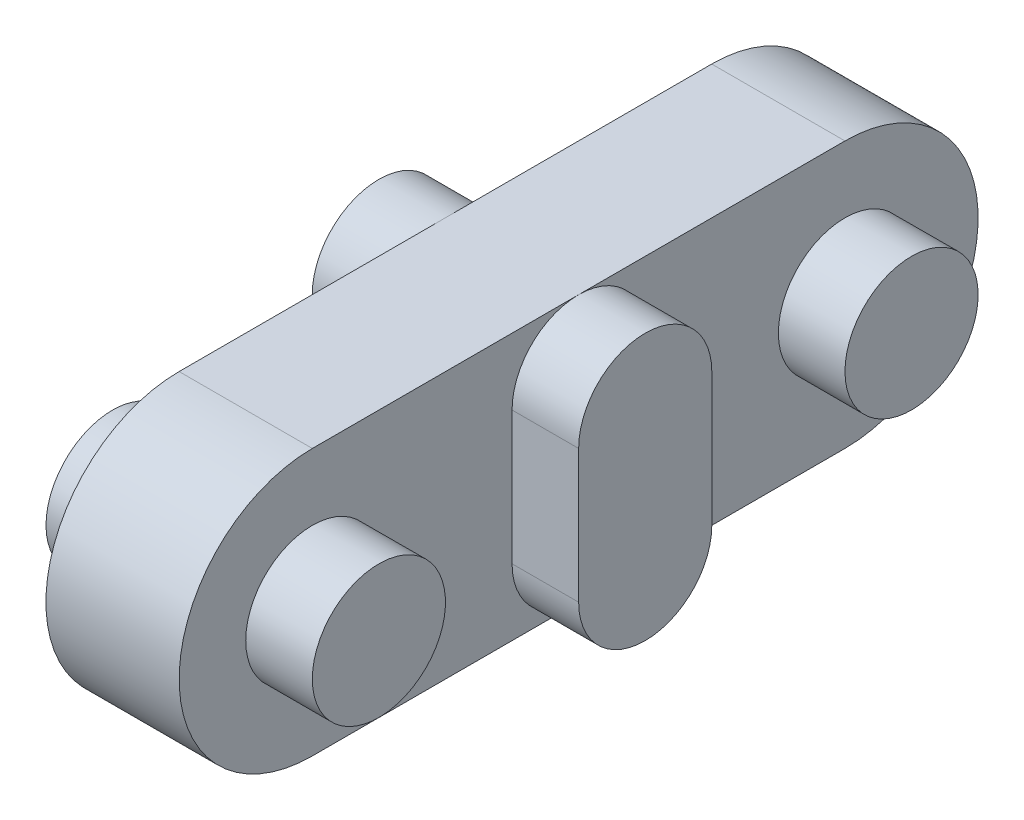
ISO-10303-21;
HEADER;
FILE_DESCRIPTION(('STEP AP214'),'2;1');
FILE_NAME('part.step','',(''),(''),'','','');
FILE_SCHEMA(('AUTOMOTIVE_DESIGN { 1 0 10303 214 1 1 1 1 }'));
ENDSEC;
DATA;
#1=APPLICATION_CONTEXT('core data for automotive mechanical design processes');
#2=APPLICATION_PROTOCOL_DEFINITION('international standard','automotive_design',2000,#1);
#3=PRODUCT_CONTEXT('',#1,'mechanical');
#4=PRODUCT('Part','Part','',(#3));
#5=PRODUCT_RELATED_PRODUCT_CATEGORY('part','',(#4));
#6=PRODUCT_DEFINITION_FORMATION('','',#4);
#7=PRODUCT_DEFINITION_CONTEXT('part definition',#1,'design');
#8=PRODUCT_DEFINITION('design','',#6,#7);
#9=PRODUCT_DEFINITION_SHAPE('','',#8);
#10=(LENGTH_UNIT() NAMED_UNIT(*) SI_UNIT(.MILLI.,.METRE.));
#11=(NAMED_UNIT(*) PLANE_ANGLE_UNIT() SI_UNIT($,.RADIAN.));
#12=(NAMED_UNIT(*) SI_UNIT($,.STERADIAN.) SOLID_ANGLE_UNIT());
#13=UNCERTAINTY_MEASURE_WITH_UNIT(LENGTH_MEASURE(1.E-05),#10,'distance_accuracy_value','');
#14=(GEOMETRIC_REPRESENTATION_CONTEXT(3) GLOBAL_UNCERTAINTY_ASSIGNED_CONTEXT((#13)) GLOBAL_UNIT_ASSIGNED_CONTEXT((#10,
#11,#12)) REPRESENTATION_CONTEXT('',''));
#15=CARTESIAN_POINT('',(0.,0.,0.));
#16=DIRECTION('',(0.,0.,1.));
#17=DIRECTION('',(1.,0.,0.));
#18=AXIS2_PLACEMENT_3D('',#15,#16,#17);
#19=CARTESIAN_POINT('',(0.,-5.,5.));
#20=DIRECTION('',(1.,0.,0.));
#21=DIRECTION('',(0.,0.,-1.));
#22=AXIS2_PLACEMENT_3D('',#19,#20,#21);
#23=PLANE('',#22);
#24=CARTESIAN_POINT('',(0.,-5.,5.));
#25=DIRECTION('',(-1.,0.,0.));
#26=DIRECTION('',(0.,0.,1.));
#27=AXIS2_PLACEMENT_3D('',#24,#25,#26);
#28=CIRCLE('',#27,2.5);
#29=CARTESIAN_POINT('',(0.,-5.,7.5));
#30=VERTEX_POINT('',#29);
#31=EDGE_CURVE('E164',#30,#30,#28,.T.);
#32=ORIENTED_EDGE('',*,*,#31,.F.);
#33=EDGE_LOOP('',(#32));
#34=FACE_BOUND('',#33,.T.);
#35=DIRECTION('',(0.,-1.,0.));
#36=VECTOR('',#35,1.);
#37=CARTESIAN_POINT('',(0.,-2.5,12.5));
#38=LINE('',#37,#36);
#39=CARTESIAN_POINT('',(0.,-2.5,12.5));
#40=VERTEX_POINT('',#39);
#41=CARTESIAN_POINT('',(0.,-7.5,12.5));
#42=VERTEX_POINT('',#41);
#43=EDGE_CURVE('E54',#40,#42,#38,.T.);
#44=ORIENTED_EDGE('',*,*,#43,.F.);
#45=CARTESIAN_POINT('',(0.,-2.5,15.));
#46=DIRECTION('',(1.,0.,0.));
#47=DIRECTION('',(0.,0.,-1.));
#48=AXIS2_PLACEMENT_3D('',#45,#46,#47);
#49=CIRCLE('',#48,2.5);
#50=CARTESIAN_POINT('',(0.,0.,15.));
#51=VERTEX_POINT('',#50);
#52=EDGE_CURVE('E182',#51,#40,#49,.F.);
#53=ORIENTED_EDGE('',*,*,#52,.F.);
#54=DIRECTION('',(0.,0.,1.));
#55=VECTOR('',#54,1.);
#56=CARTESIAN_POINT('',(0.,0.,5.));
#57=LINE('',#56,#55);
#58=CARTESIAN_POINT('',(0.,0.,5.));
#59=VERTEX_POINT('',#58);
#60=EDGE_CURVE('E225',#59,#51,#57,.T.);
#61=ORIENTED_EDGE('',*,*,#60,.F.);
#62=CARTESIAN_POINT('',(0.,-5.,5.));
#63=DIRECTION('',(1.,0.,0.));
#64=DIRECTION('',(0.,0.,-1.));
#65=AXIS2_PLACEMENT_3D('',#62,#63,#64);
#66=CIRCLE('',#65,5.);
#67=CARTESIAN_POINT('',(0.,-10.,5.));
#68=VERTEX_POINT('',#67);
#69=EDGE_CURVE('E220',#68,#59,#66,.T.);
#70=ORIENTED_EDGE('',*,*,#69,.F.);
#71=DIRECTION('',(0.,0.,-1.));
#72=VECTOR('',#71,1.);
#73=CARTESIAN_POINT('',(0.,-10.,25.));
#74=LINE('',#73,#72);
#75=CARTESIAN_POINT('',(0.,-10.,15.));
#76=VERTEX_POINT('',#75);
#77=EDGE_CURVE('E231',#76,#68,#74,.T.);
#78=ORIENTED_EDGE('',*,*,#77,.F.);
#79=CARTESIAN_POINT('',(0.,-7.5,15.));
#80=DIRECTION('',(1.,0.,0.));
#81=DIRECTION('',(0.,0.,-1.));
#82=AXIS2_PLACEMENT_3D('',#79,#80,#81);
#83=CIRCLE('',#82,2.5);
#84=EDGE_CURVE('E59',#42,#76,#83,.F.);
#85=ORIENTED_EDGE('',*,*,#84,.F.);
#86=EDGE_LOOP('',(#44,#53,#61,#70,#78,#85));
#87=FACE_BOUND('',#86,.T.);
#88=ADVANCED_FACE('F39',(#34,#87),#23,.F.);
#89=CARTESIAN_POINT('',(0.,-5.,25.));
#90=DIRECTION('',(-1.,0.,0.));
#91=DIRECTION('',(0.,0.,1.));
#92=AXIS2_PLACEMENT_3D('',#89,#90,#91);
#93=CIRCLE('',#92,2.5);
#94=CARTESIAN_POINT('',(0.,-5.,27.5));
#95=VERTEX_POINT('',#94);
#96=EDGE_CURVE('E543',#95,#95,#93,.T.);
#97=ORIENTED_EDGE('',*,*,#96,.F.);
#98=EDGE_LOOP('',(#97));
#99=FACE_BOUND('',#98,.T.);
#100=CARTESIAN_POINT('',(0.,-7.5,17.5));
#101=VERTEX_POINT('',#100);
#102=EDGE_CURVE('E146',#76,#101,#83,.F.);
#103=ORIENTED_EDGE('',*,*,#102,.F.);
#104=CARTESIAN_POINT('',(0.,-10.,25.));
#105=VERTEX_POINT('',#104);
#106=EDGE_CURVE('E232',#105,#76,#74,.T.);
#107=ORIENTED_EDGE('',*,*,#106,.F.);
#108=CARTESIAN_POINT('',(0.,-5.,25.));
#109=DIRECTION('',(1.,0.,0.));
#110=DIRECTION('',(0.,0.,-1.));
#111=AXIS2_PLACEMENT_3D('',#108,#109,#110);
#112=CIRCLE('',#111,5.);
#113=CARTESIAN_POINT('',(0.,0.,25.));
#114=VERTEX_POINT('',#113);
#115=EDGE_CURVE('E228',#114,#105,#112,.T.);
#116=ORIENTED_EDGE('',*,*,#115,.F.);
#117=EDGE_CURVE('E223',#51,#114,#57,.T.);
#118=ORIENTED_EDGE('',*,*,#117,.F.);
#119=CARTESIAN_POINT('',(0.,-2.5,17.5));
#120=VERTEX_POINT('',#119);
#121=EDGE_CURVE('E178',#120,#51,#49,.F.);
#122=ORIENTED_EDGE('',*,*,#121,.F.);
#123=DIRECTION('',(0.,1.,0.));
#124=VECTOR('',#123,1.);
#125=CARTESIAN_POINT('',(0.,-7.5,17.5));
#126=LINE('',#125,#124);
#127=EDGE_CURVE('E181',#101,#120,#126,.T.);
#128=ORIENTED_EDGE('',*,*,#127,.F.);
#129=EDGE_LOOP('',(#103,#107,#116,#118,#122,#128));
#130=FACE_BOUND('',#129,.T.);
#131=ADVANCED_FACE('F318',(#99,#130),#23,.F.);
#132=CARTESIAN_POINT('',(5.00229629775137,-5.,5.));
#133=DIRECTION('',(1.,0.,0.));
#134=DIRECTION('',(0.,0.,-1.));
#135=AXIS2_PLACEMENT_3D('',#132,#133,#134);
#136=PLANE('',#135);
#137=CARTESIAN_POINT('',(5.00229629775137,-5.,5.));
#138=DIRECTION('',(1.,0.,0.));
#139=DIRECTION('',(0.,0.,-1.));
#140=AXIS2_PLACEMENT_3D('',#137,#138,#139);
#141=CIRCLE('',#140,2.5);
#142=CARTESIAN_POINT('',(5.00229629775137,-5.,2.5));
#143=VERTEX_POINT('',#142);
#144=EDGE_CURVE('E47',#143,#143,#141,.T.);
#145=ORIENTED_EDGE('',*,*,#144,.F.);
#146=EDGE_LOOP('',(#145));
#147=FACE_BOUND('',#146,.T.);
#148=CARTESIAN_POINT('',(5.00229629775137,-2.5,15.));
#149=DIRECTION('',(1.,0.,0.));
#150=DIRECTION('',(0.,0.,-1.));
#151=AXIS2_PLACEMENT_3D('',#148,#149,#150);
#152=CIRCLE('',#151,2.5);
#153=CARTESIAN_POINT('',(5.00229629775137,0.,15.));
#154=VERTEX_POINT('',#153);
#155=CARTESIAN_POINT('',(5.00229629775137,-2.5,12.5));
#156=VERTEX_POINT('',#155);
#157=EDGE_CURVE('E219',#154,#156,#152,.F.);
#158=ORIENTED_EDGE('',*,*,#157,.T.);
#159=DIRECTION('',(0.,-1.,0.));
#160=VECTOR('',#159,1.);
#161=CARTESIAN_POINT('',(5.00229629775137,-7.5,12.5));
#162=LINE('',#161,#160);
#163=CARTESIAN_POINT('',(5.00229629775137,-7.5,12.5));
#164=VERTEX_POINT('',#163);
#165=EDGE_CURVE('E206',#156,#164,#162,.T.);
#166=ORIENTED_EDGE('',*,*,#165,.T.);
#167=CARTESIAN_POINT('',(5.00229629775137,-7.5,15.));
#168=DIRECTION('',(1.,0.,0.));
#169=DIRECTION('',(0.,0.,-1.));
#170=AXIS2_PLACEMENT_3D('',#167,#168,#169);
#171=CIRCLE('',#170,2.5);
#172=CARTESIAN_POINT('',(5.00229629775137,-10.,15.));
#173=VERTEX_POINT('',#172);
#174=EDGE_CURVE('E210',#164,#173,#171,.F.);
#175=ORIENTED_EDGE('',*,*,#174,.T.);
#176=DIRECTION('',(0.,0.,-1.));
#177=VECTOR('',#176,1.);
#178=CARTESIAN_POINT('',(5.00229629775137,-10.,25.));
#179=LINE('',#178,#177);
#180=CARTESIAN_POINT('',(5.00229629775137,-10.,5.));
#181=VERTEX_POINT('',#180);
#182=EDGE_CURVE('E245',#173,#181,#179,.T.);
#183=ORIENTED_EDGE('',*,*,#182,.T.);
#184=CARTESIAN_POINT('',(5.00229629775137,-5.,5.));
#185=DIRECTION('',(1.,0.,0.));
#186=DIRECTION('',(0.,0.,-1.));
#187=AXIS2_PLACEMENT_3D('',#184,#185,#186);
#188=CIRCLE('',#187,5.);
#189=CARTESIAN_POINT('',(5.00229629775137,0.,5.));
#190=VERTEX_POINT('',#189);
#191=EDGE_CURVE('E209',#181,#190,#188,.T.);
#192=ORIENTED_EDGE('',*,*,#191,.T.);
#193=DIRECTION('',(0.,0.,1.));
#194=VECTOR('',#193,1.);
#195=CARTESIAN_POINT('',(5.00229629775137,0.,5.));
#196=LINE('',#195,#194);
#197=EDGE_CURVE('E239',#190,#154,#196,.T.);
#198=ORIENTED_EDGE('',*,*,#197,.T.);
#199=EDGE_LOOP('',(#158,#166,#175,#183,#192,#198));
#200=FACE_BOUND('',#199,.T.);
#201=ADVANCED_FACE('F265',(#147,#200),#136,.T.);
#202=CARTESIAN_POINT('',(0.,-5.,5.));
#203=DIRECTION('',(1.,0.,0.));
#204=DIRECTION('',(0.,0.,-1.));
#205=AXIS2_PLACEMENT_3D('',#202,#203,#204);
#206=CYLINDRICAL_SURFACE('',#205,5.);
#207=ORIENTED_EDGE('',*,*,#191,.F.);
#208=DIRECTION('',(1.,0.,0.));
#209=VECTOR('',#208,1.);
#210=CARTESIAN_POINT('',(0.,-10.,5.));
#211=LINE('',#210,#209);
#212=EDGE_CURVE('E248',#68,#181,#211,.T.);
#213=ORIENTED_EDGE('',*,*,#212,.F.);
#214=ORIENTED_EDGE('',*,*,#69,.T.);
#215=DIRECTION('',(1.,0.,0.));
#216=VECTOR('',#215,1.);
#217=CARTESIAN_POINT('',(0.,0.,5.));
#218=LINE('',#217,#216);
#219=EDGE_CURVE('E235',#59,#190,#218,.T.);
#220=ORIENTED_EDGE('',*,*,#219,.T.);
#221=EDGE_LOOP('',(#207,#213,#214,#220));
#222=FACE_BOUND('',#221,.T.);
#223=ADVANCED_FACE('F41',(#222),#206,.T.);
#224=CARTESIAN_POINT('',(0.,-10.,25.));
#225=DIRECTION('',(0.,-1.,0.));
#226=DIRECTION('',(0.,0.,-1.));
#227=AXIS2_PLACEMENT_3D('',#224,#225,#226);
#228=PLANE('',#227);
#229=CARTESIAN_POINT('',(5.00229629775137,-10.,25.));
#230=VERTEX_POINT('',#229);
#231=EDGE_CURVE('E224',#230,#173,#179,.T.);
#232=ORIENTED_EDGE('',*,*,#231,.F.);
#233=DIRECTION('',(1.,0.,0.));
#234=VECTOR('',#233,1.);
#235=CARTESIAN_POINT('',(0.,-10.,25.));
#236=LINE('',#235,#234);
#237=EDGE_CURVE('E251',#105,#230,#236,.T.);
#238=ORIENTED_EDGE('',*,*,#237,.F.);
#239=ORIENTED_EDGE('',*,*,#106,.T.);
#240=ORIENTED_EDGE('',*,*,#77,.T.);
#241=ORIENTED_EDGE('',*,*,#212,.T.);
#242=ORIENTED_EDGE('',*,*,#182,.F.);
#243=EDGE_LOOP('',(#232,#238,#239,#240,#241,#242));
#244=FACE_BOUND('',#243,.T.);
#245=ADVANCED_FACE('F285',(#244),#228,.T.);
#246=CARTESIAN_POINT('',(0.,-5.,25.));
#247=DIRECTION('',(1.,0.,0.));
#248=DIRECTION('',(0.,0.,-1.));
#249=AXIS2_PLACEMENT_3D('',#246,#247,#248);
#250=CYLINDRICAL_SURFACE('',#249,5.);
#251=CARTESIAN_POINT('',(5.00229629775137,-5.,25.));
#252=DIRECTION('',(1.,0.,0.));
#253=DIRECTION('',(0.,0.,-1.));
#254=AXIS2_PLACEMENT_3D('',#251,#252,#253);
#255=CIRCLE('',#254,5.);
#256=CARTESIAN_POINT('',(5.00229629775137,0.,25.));
#257=VERTEX_POINT('',#256);
#258=EDGE_CURVE('E242',#257,#230,#255,.T.);
#259=ORIENTED_EDGE('',*,*,#258,.F.);
#260=DIRECTION('',(1.,0.,0.));
#261=VECTOR('',#260,1.);
#262=CARTESIAN_POINT('',(0.,0.,25.));
#263=LINE('',#262,#261);
#264=EDGE_CURVE('E253',#114,#257,#263,.T.);
#265=ORIENTED_EDGE('',*,*,#264,.F.);
#266=ORIENTED_EDGE('',*,*,#115,.T.);
#267=ORIENTED_EDGE('',*,*,#237,.T.);
#268=EDGE_LOOP('',(#259,#265,#266,#267));
#269=FACE_BOUND('',#268,.T.);
#270=ADVANCED_FACE('F281',(#269),#250,.T.);
#271=CARTESIAN_POINT('',(0.,0.,5.));
#272=DIRECTION('',(0.,1.,0.));
#273=DIRECTION('',(0.,0.,1.));
#274=AXIS2_PLACEMENT_3D('',#271,#272,#273);
#275=PLANE('',#274);
#276=ORIENTED_EDGE('',*,*,#197,.F.);
#277=ORIENTED_EDGE('',*,*,#219,.F.);
#278=ORIENTED_EDGE('',*,*,#60,.T.);
#279=ORIENTED_EDGE('',*,*,#117,.T.);
#280=ORIENTED_EDGE('',*,*,#264,.T.);
#281=EDGE_CURVE('E238',#154,#257,#196,.T.);
#282=ORIENTED_EDGE('',*,*,#281,.F.);
#283=EDGE_LOOP('',(#276,#277,#278,#279,#280,#282));
#284=FACE_BOUND('',#283,.T.);
#285=ADVANCED_FACE('F275',(#284),#275,.T.);
#286=CARTESIAN_POINT('',(5.00229629775137,-5.,25.));
#287=DIRECTION('',(1.,0.,0.));
#288=DIRECTION('',(0.,0.,-1.));
#289=AXIS2_PLACEMENT_3D('',#286,#287,#288);
#290=CIRCLE('',#289,2.5);
#291=CARTESIAN_POINT('',(5.00229629775137,-5.,22.5));
#292=VERTEX_POINT('',#291);
#293=EDGE_CURVE('E11',#292,#292,#290,.T.);
#294=ORIENTED_EDGE('',*,*,#293,.F.);
#295=EDGE_LOOP('',(#294));
#296=FACE_BOUND('',#295,.T.);
#297=ORIENTED_EDGE('',*,*,#231,.T.);
#298=CARTESIAN_POINT('',(5.00229629775137,-7.5,17.5));
#299=VERTEX_POINT('',#298);
#300=EDGE_CURVE('E214',#173,#299,#171,.F.);
#301=ORIENTED_EDGE('',*,*,#300,.T.);
#302=DIRECTION('',(0.,1.,0.));
#303=VECTOR('',#302,1.);
#304=CARTESIAN_POINT('',(5.00229629775137,-2.5,17.5));
#305=LINE('',#304,#303);
#306=CARTESIAN_POINT('',(5.00229629775137,-2.5,17.5));
#307=VERTEX_POINT('',#306);
#308=EDGE_CURVE('E213',#299,#307,#305,.T.);
#309=ORIENTED_EDGE('',*,*,#308,.T.);
#310=EDGE_CURVE('E200',#307,#154,#152,.F.);
#311=ORIENTED_EDGE('',*,*,#310,.T.);
#312=ORIENTED_EDGE('',*,*,#281,.T.);
#313=ORIENTED_EDGE('',*,*,#258,.T.);
#314=EDGE_LOOP('',(#297,#301,#309,#311,#312,#313));
#315=FACE_BOUND('',#314,.T.);
#316=ADVANCED_FACE('F273',(#296,#315),#136,.T.);
#317=CARTESIAN_POINT('',(-0.00199999999999419,-2.5,17.5));
#318=DIRECTION('',(0.,0.,1.));
#319=DIRECTION('',(1.,0.,0.));
#320=AXIS2_PLACEMENT_3D('',#317,#318,#319);
#321=PLANE('',#320);
#322=ORIENTED_EDGE('',*,*,#308,.F.);
#323=DIRECTION('',(1.,0.,0.));
#324=VECTOR('',#323,1.);
#325=CARTESIAN_POINT('',(-0.00199999999999419,-7.5,17.5));
#326=LINE('',#325,#324);
#327=CARTESIAN_POINT('',(7.50229629775137,-7.5,17.5));
#328=VERTEX_POINT('',#327);
#329=EDGE_CURVE('E201',#299,#328,#326,.T.);
#330=ORIENTED_EDGE('',*,*,#329,.T.);
#331=DIRECTION('',(0.,-1.,0.));
#332=VECTOR('',#331,1.);
#333=CARTESIAN_POINT('',(7.50229629775137,-2.5,17.5));
#334=LINE('',#333,#332);
#335=CARTESIAN_POINT('',(7.50229629775137,-2.5,17.5));
#336=VERTEX_POINT('',#335);
#337=EDGE_CURVE('E193',#336,#328,#334,.T.);
#338=ORIENTED_EDGE('',*,*,#337,.F.);
#339=DIRECTION('',(1.,0.,0.));
#340=VECTOR('',#339,1.);
#341=CARTESIAN_POINT('',(-0.00199999999999419,-2.5,17.5));
#342=LINE('',#341,#340);
#343=EDGE_CURVE('E198',#307,#336,#342,.T.);
#344=ORIENTED_EDGE('',*,*,#343,.F.);
#345=EDGE_LOOP('',(#322,#330,#338,#344));
#346=FACE_BOUND('',#345,.T.);
#347=ADVANCED_FACE('F300',(#346),#321,.T.);
#348=CARTESIAN_POINT('',(-0.00199999999999419,-7.5,15.));
#349=DIRECTION('',(1.,0.,0.));
#350=DIRECTION('',(0.,0.,-1.));
#351=AXIS2_PLACEMENT_3D('',#348,#349,#350);
#352=CYLINDRICAL_SURFACE('',#351,2.5);
#353=ORIENTED_EDGE('',*,*,#329,.F.);
#354=ORIENTED_EDGE('',*,*,#300,.F.);
#355=ORIENTED_EDGE('',*,*,#174,.F.);
#356=DIRECTION('',(1.,0.,0.));
#357=VECTOR('',#356,1.);
#358=CARTESIAN_POINT('',(-0.00199999999999419,-7.5,12.5));
#359=LINE('',#358,#357);
#360=CARTESIAN_POINT('',(7.50229629775137,-7.5,12.5));
#361=VERTEX_POINT('',#360);
#362=EDGE_CURVE('E203',#164,#361,#359,.T.);
#363=ORIENTED_EDGE('',*,*,#362,.T.);
#364=CARTESIAN_POINT('',(7.50229629775137,-7.5,15.));
#365=DIRECTION('',(1.,0.,0.));
#366=DIRECTION('',(0.,0.,-1.));
#367=AXIS2_PLACEMENT_3D('',#364,#365,#366);
#368=CIRCLE('',#367,2.5);
#369=EDGE_CURVE('E190',#328,#361,#368,.T.);
#370=ORIENTED_EDGE('',*,*,#369,.F.);
#371=EDGE_LOOP('',(#353,#354,#355,#363,#370));
#372=FACE_BOUND('',#371,.T.);
#373=ADVANCED_FACE('F291',(#372),#352,.T.);
#374=CARTESIAN_POINT('',(7.50229629775137,-2.5,15.));
#375=DIRECTION('',(1.,0.,0.));
#376=DIRECTION('',(0.,0.,-1.));
#377=AXIS2_PLACEMENT_3D('',#374,#375,#376);
#378=PLANE('',#377);
#379=CARTESIAN_POINT('',(7.50229629775137,-2.5,15.));
#380=DIRECTION('',(1.,0.,0.));
#381=DIRECTION('',(0.,0.,-1.));
#382=AXIS2_PLACEMENT_3D('',#379,#380,#381);
#383=CIRCLE('',#382,2.5);
#384=CARTESIAN_POINT('',(7.50229629775137,-2.5,12.5));
#385=VERTEX_POINT('',#384);
#386=EDGE_CURVE('E184',#385,#336,#383,.T.);
#387=ORIENTED_EDGE('',*,*,#386,.T.);
#388=ORIENTED_EDGE('',*,*,#337,.T.);
#389=ORIENTED_EDGE('',*,*,#369,.T.);
#390=DIRECTION('',(0.,1.,0.));
#391=VECTOR('',#390,1.);
#392=CARTESIAN_POINT('',(7.50229629775137,-7.5,12.5));
#393=LINE('',#392,#391);
#394=EDGE_CURVE('E186',#361,#385,#393,.T.);
#395=ORIENTED_EDGE('',*,*,#394,.T.);
#396=EDGE_LOOP('',(#387,#388,#389,#395));
#397=FACE_BOUND('',#396,.T.);
#398=ADVANCED_FACE('F297',(#397),#378,.T.);
#399=CARTESIAN_POINT('',(-0.00199999999999419,-2.5,15.));
#400=DIRECTION('',(1.,0.,0.));
#401=DIRECTION('',(0.,0.,-1.));
#402=AXIS2_PLACEMENT_3D('',#399,#400,#401);
#403=CYLINDRICAL_SURFACE('',#402,2.5);
#404=DIRECTION('',(1.,0.,0.));
#405=VECTOR('',#404,1.);
#406=CARTESIAN_POINT('',(-0.00199999999999419,-2.5,12.5));
#407=LINE('',#406,#405);
#408=EDGE_CURVE('E189',#156,#385,#407,.T.);
#409=ORIENTED_EDGE('',*,*,#408,.F.);
#410=ORIENTED_EDGE('',*,*,#157,.F.);
#411=ORIENTED_EDGE('',*,*,#310,.F.);
#412=ORIENTED_EDGE('',*,*,#343,.T.);
#413=ORIENTED_EDGE('',*,*,#386,.F.);
#414=EDGE_LOOP('',(#409,#410,#411,#412,#413));
#415=FACE_BOUND('',#414,.T.);
#416=ADVANCED_FACE('F269',(#415),#403,.T.);
#417=CARTESIAN_POINT('',(-0.00199999999999419,-7.5,12.5));
#418=DIRECTION('',(0.,0.,-1.));
#419=DIRECTION('',(-1.,0.,0.));
#420=AXIS2_PLACEMENT_3D('',#417,#418,#419);
#421=PLANE('',#420);
#422=ORIENTED_EDGE('',*,*,#165,.F.);
#423=ORIENTED_EDGE('',*,*,#408,.T.);
#424=ORIENTED_EDGE('',*,*,#394,.F.);
#425=ORIENTED_EDGE('',*,*,#362,.F.);
#426=EDGE_LOOP('',(#422,#423,#424,#425));
#427=FACE_BOUND('',#426,.T.);
#428=ADVANCED_FACE('F295',(#427),#421,.T.);
#429=CARTESIAN_POINT('',(7.50429629775137,-7.5,17.5));
#430=DIRECTION('',(0.,0.,1.));
#431=DIRECTION('',(1.,0.,0.));
#432=AXIS2_PLACEMENT_3D('',#429,#430,#431);
#433=PLANE('',#432);
#434=DIRECTION('',(-1.,0.,0.));
#435=VECTOR('',#434,1.);
#436=CARTESIAN_POINT('',(7.50429629775137,-7.5,17.5));
#437=LINE('',#436,#435);
#438=CARTESIAN_POINT('',(-2.5,-7.5,17.5));
#439=VERTEX_POINT('',#438);
#440=EDGE_CURVE('E140',#101,#439,#437,.T.);
#441=ORIENTED_EDGE('',*,*,#440,.F.);
#442=ORIENTED_EDGE('',*,*,#127,.T.);
#443=DIRECTION('',(-1.,0.,0.));
#444=VECTOR('',#443,1.);
#445=CARTESIAN_POINT('',(7.50429629775137,-2.5,17.5));
#446=LINE('',#445,#444);
#447=CARTESIAN_POINT('',(-2.5,-2.5,17.5));
#448=VERTEX_POINT('',#447);
#449=EDGE_CURVE('E149',#120,#448,#446,.T.);
#450=ORIENTED_EDGE('',*,*,#449,.T.);
#451=DIRECTION('',(0.,1.,0.));
#452=VECTOR('',#451,1.);
#453=CARTESIAN_POINT('',(-2.5,-7.5,17.5));
#454=LINE('',#453,#452);
#455=EDGE_CURVE('E152',#439,#448,#454,.T.);
#456=ORIENTED_EDGE('',*,*,#455,.F.);
#457=EDGE_LOOP('',(#441,#442,#450,#456));
#458=FACE_BOUND('',#457,.T.);
#459=ADVANCED_FACE('F153',(#458),#433,.T.);
#460=CARTESIAN_POINT('',(-2.5,-7.5,15.));
#461=DIRECTION('',(-1.,0.,0.));
#462=DIRECTION('',(0.,0.,1.));
#463=AXIS2_PLACEMENT_3D('',#460,#461,#462);
#464=PLANE('',#463);
#465=CARTESIAN_POINT('',(-2.5,-7.5,15.));
#466=DIRECTION('',(-1.,0.,0.));
#467=DIRECTION('',(0.,0.,1.));
#468=AXIS2_PLACEMENT_3D('',#465,#466,#467);
#469=CIRCLE('',#468,2.5);
#470=CARTESIAN_POINT('',(-2.5,-7.5,12.5));
#471=VERTEX_POINT('',#470);
#472=EDGE_CURVE('E145',#471,#439,#469,.T.);
#473=ORIENTED_EDGE('',*,*,#472,.T.);
#474=ORIENTED_EDGE('',*,*,#455,.T.);
#475=CARTESIAN_POINT('',(-2.5,-2.5,15.));
#476=DIRECTION('',(-1.,0.,0.));
#477=DIRECTION('',(0.,0.,1.));
#478=AXIS2_PLACEMENT_3D('',#475,#476,#477);
#479=CIRCLE('',#478,2.5);
#480=CARTESIAN_POINT('',(-2.5,-2.5,12.5));
#481=VERTEX_POINT('',#480);
#482=EDGE_CURVE('E158',#448,#481,#479,.T.);
#483=ORIENTED_EDGE('',*,*,#482,.T.);
#484=DIRECTION('',(0.,-1.,0.));
#485=VECTOR('',#484,1.);
#486=CARTESIAN_POINT('',(-2.5,-2.5,12.5));
#487=LINE('',#486,#485);
#488=EDGE_CURVE('E163',#481,#471,#487,.T.);
#489=ORIENTED_EDGE('',*,*,#488,.T.);
#490=EDGE_LOOP('',(#473,#474,#483,#489));
#491=FACE_BOUND('',#490,.T.);
#492=ADVANCED_FACE('F161',(#491),#464,.T.);
#493=CARTESIAN_POINT('',(7.50429629775137,-7.5,15.));
#494=DIRECTION('',(-1.,0.,0.));
#495=DIRECTION('',(0.,0.,1.));
#496=AXIS2_PLACEMENT_3D('',#493,#494,#495);
#497=CYLINDRICAL_SURFACE('',#496,2.5);
#498=ORIENTED_EDGE('',*,*,#84,.T.);
#499=ORIENTED_EDGE('',*,*,#102,.T.);
#500=ORIENTED_EDGE('',*,*,#440,.T.);
#501=ORIENTED_EDGE('',*,*,#472,.F.);
#502=DIRECTION('',(-1.,0.,0.));
#503=VECTOR('',#502,1.);
#504=CARTESIAN_POINT('',(7.50429629775137,-7.5,12.5));
#505=LINE('',#504,#503);
#506=EDGE_CURVE('E172',#42,#471,#505,.T.);
#507=ORIENTED_EDGE('',*,*,#506,.F.);
#508=EDGE_LOOP('',(#498,#499,#500,#501,#507));
#509=FACE_BOUND('',#508,.T.);
#510=ADVANCED_FACE('F142',(#509),#497,.T.);
#511=CARTESIAN_POINT('',(7.50429629775137,-2.5,15.));
#512=DIRECTION('',(-1.,0.,0.));
#513=DIRECTION('',(0.,0.,1.));
#514=AXIS2_PLACEMENT_3D('',#511,#512,#513);
#515=CYLINDRICAL_SURFACE('',#514,2.5);
#516=ORIENTED_EDGE('',*,*,#121,.T.);
#517=ORIENTED_EDGE('',*,*,#52,.T.);
#518=DIRECTION('',(-1.,0.,0.));
#519=VECTOR('',#518,1.);
#520=CARTESIAN_POINT('',(7.50429629775137,-2.5,12.5));
#521=LINE('',#520,#519);
#522=EDGE_CURVE('E174',#40,#481,#521,.T.);
#523=ORIENTED_EDGE('',*,*,#522,.T.);
#524=ORIENTED_EDGE('',*,*,#482,.F.);
#525=ORIENTED_EDGE('',*,*,#449,.F.);
#526=EDGE_LOOP('',(#516,#517,#523,#524,#525));
#527=FACE_BOUND('',#526,.T.);
#528=ADVANCED_FACE('F314',(#527),#515,.T.);
#529=CARTESIAN_POINT('',(7.50429629775137,-2.5,12.5));
#530=DIRECTION('',(0.,0.,-1.));
#531=DIRECTION('',(-1.,0.,0.));
#532=AXIS2_PLACEMENT_3D('',#529,#530,#531);
#533=PLANE('',#532);
#534=ORIENTED_EDGE('',*,*,#522,.F.);
#535=ORIENTED_EDGE('',*,*,#43,.T.);
#536=ORIENTED_EDGE('',*,*,#506,.T.);
#537=ORIENTED_EDGE('',*,*,#488,.F.);
#538=EDGE_LOOP('',(#534,#535,#536,#537));
#539=FACE_BOUND('',#538,.T.);
#540=ADVANCED_FACE('F303',(#539),#533,.T.);
#541=CARTESIAN_POINT('',(0.,-5.,5.));
#542=DIRECTION('',(-1.,0.,0.));
#543=DIRECTION('',(0.,0.,1.));
#544=AXIS2_PLACEMENT_3D('',#541,#542,#543);
#545=CYLINDRICAL_SURFACE('',#544,2.5);
#546=ORIENTED_EDGE('',*,*,#31,.T.);
#547=EDGE_LOOP('',(#546));
#548=FACE_BOUND('',#547,.T.);
#549=CARTESIAN_POINT('',(-2.49770370224863,-5.,5.));
#550=DIRECTION('',(-1.,0.,0.));
#551=DIRECTION('',(0.,0.,1.));
#552=AXIS2_PLACEMENT_3D('',#549,#550,#551);
#553=CIRCLE('',#552,2.5);
#554=CARTESIAN_POINT('',(-2.49770370224863,-5.,7.5));
#555=VERTEX_POINT('',#554);
#556=EDGE_CURVE('E167',#555,#555,#553,.T.);
#557=ORIENTED_EDGE('',*,*,#556,.F.);
#558=EDGE_LOOP('',(#557));
#559=FACE_BOUND('',#558,.T.);
#560=ADVANCED_FACE('F313',(#548,#559),#545,.T.);
#561=CARTESIAN_POINT('',(-2.49770370224863,-5.,5.));
#562=DIRECTION('',(-1.,0.,0.));
#563=DIRECTION('',(0.,0.,1.));
#564=AXIS2_PLACEMENT_3D('',#561,#562,#563);
#565=PLANE('',#564);
#566=ORIENTED_EDGE('',*,*,#556,.T.);
#567=EDGE_LOOP('',(#566));
#568=FACE_BOUND('',#567,.T.);
#569=ADVANCED_FACE('F408',(#568),#565,.T.);
#570=CARTESIAN_POINT('',(7.50229629775137,-5.,5.));
#571=DIRECTION('',(-1.,0.,0.));
#572=DIRECTION('',(0.,0.,1.));
#573=AXIS2_PLACEMENT_3D('',#570,#571,#572);
#574=CYLINDRICAL_SURFACE('',#573,2.5);
#575=CARTESIAN_POINT('',(7.50229629775137,-5.,5.));
#576=DIRECTION('',(-1.,0.,0.));
#577=DIRECTION('',(0.,0.,1.));
#578=AXIS2_PLACEMENT_3D('',#575,#576,#577);
#579=CIRCLE('',#578,2.5);
#580=CARTESIAN_POINT('',(7.50229629775137,-5.,7.5));
#581=VERTEX_POINT('',#580);
#582=EDGE_CURVE('E537',#581,#581,#579,.T.);
#583=ORIENTED_EDGE('',*,*,#582,.T.);
#584=EDGE_LOOP('',(#583));
#585=FACE_BOUND('',#584,.T.);
#586=ORIENTED_EDGE('',*,*,#144,.T.);
#587=EDGE_LOOP('',(#586));
#588=FACE_BOUND('',#587,.T.);
#589=ADVANCED_FACE('F404',(#585,#588),#574,.T.);
#590=CARTESIAN_POINT('',(7.50229629775137,-2.5,5.));
#591=DIRECTION('',(1.,0.,0.));
#592=DIRECTION('',(0.,0.,-1.));
#593=AXIS2_PLACEMENT_3D('',#590,#591,#592);
#594=PLANE('',#593);
#595=ORIENTED_EDGE('',*,*,#582,.F.);
#596=EDGE_LOOP('',(#595));
#597=FACE_BOUND('',#596,.T.);
#598=ADVANCED_FACE('F348',(#597),#594,.T.);
#599=CARTESIAN_POINT('',(7.50229629775137,-5.,25.));
#600=DIRECTION('',(-1.,0.,0.));
#601=DIRECTION('',(0.,0.,1.));
#602=AXIS2_PLACEMENT_3D('',#599,#600,#601);
#603=CYLINDRICAL_SURFACE('',#602,2.5);
#604=CARTESIAN_POINT('',(7.50229629775137,-5.,25.));
#605=DIRECTION('',(-1.,0.,0.));
#606=DIRECTION('',(0.,0.,1.));
#607=AXIS2_PLACEMENT_3D('',#604,#605,#606);
#608=CIRCLE('',#607,2.5);
#609=CARTESIAN_POINT('',(7.50229629775137,-5.,27.5));
#610=VERTEX_POINT('',#609);
#611=EDGE_CURVE('E540',#610,#610,#608,.T.);
#612=ORIENTED_EDGE('',*,*,#611,.T.);
#613=EDGE_LOOP('',(#612));
#614=FACE_BOUND('',#613,.T.);
#615=ORIENTED_EDGE('',*,*,#293,.T.);
#616=EDGE_LOOP('',(#615));
#617=FACE_BOUND('',#616,.T.);
#618=ADVANCED_FACE('F353',(#614,#617),#603,.T.);
#619=CARTESIAN_POINT('',(7.50229629775137,-2.5,25.));
#620=DIRECTION('',(1.,0.,0.));
#621=DIRECTION('',(0.,0.,-1.));
#622=AXIS2_PLACEMENT_3D('',#619,#620,#621);
#623=PLANE('',#622);
#624=ORIENTED_EDGE('',*,*,#611,.F.);
#625=EDGE_LOOP('',(#624));
#626=FACE_BOUND('',#625,.T.);
#627=ADVANCED_FACE('F358',(#626),#623,.T.);
#628=CARTESIAN_POINT('',(0.,-5.,25.));
#629=DIRECTION('',(-1.,0.,0.));
#630=DIRECTION('',(0.,0.,1.));
#631=AXIS2_PLACEMENT_3D('',#628,#629,#630);
#632=CYLINDRICAL_SURFACE('',#631,2.5);
#633=ORIENTED_EDGE('',*,*,#96,.T.);
#634=EDGE_LOOP('',(#633));
#635=FACE_BOUND('',#634,.T.);
#636=CARTESIAN_POINT('',(-2.49770370224863,-5.,25.));
#637=DIRECTION('',(-1.,0.,0.));
#638=DIRECTION('',(0.,0.,1.));
#639=AXIS2_PLACEMENT_3D('',#636,#637,#638);
#640=CIRCLE('',#639,2.5);
#641=CARTESIAN_POINT('',(-2.49770370224863,-5.,27.5));
#642=VERTEX_POINT('',#641);
#643=EDGE_CURVE('E546',#642,#642,#640,.T.);
#644=ORIENTED_EDGE('',*,*,#643,.F.);
#645=EDGE_LOOP('',(#644));
#646=FACE_BOUND('',#645,.T.);
#647=ADVANCED_FACE('F368',(#635,#646),#632,.T.);
#648=CARTESIAN_POINT('',(-2.49770370224863,-5.,25.));
#649=DIRECTION('',(-1.,0.,0.));
#650=DIRECTION('',(0.,0.,1.));
#651=AXIS2_PLACEMENT_3D('',#648,#649,#650);
#652=PLANE('',#651);
#653=ORIENTED_EDGE('',*,*,#643,.T.);
#654=EDGE_LOOP('',(#653));
#655=FACE_BOUND('',#654,.T.);
#656=ADVANCED_FACE('F387',(#655),#652,.T.);
#657=CLOSED_SHELL('',(#88,#131,#201,#223,#245,#270,#285,#316,#347,#373,#398,#416,#428,#459,#492,
#510,#528,#540,#560,#569,#589,#598,#618,#627,#647,#656));
#658=MANIFOLD_SOLID_BREP('B2',#657);
#659=ADVANCED_BREP_SHAPE_REPRESENTATION('',(#18,#658),#14);
#660=SHAPE_DEFINITION_REPRESENTATION(#9,#659);
ENDSEC;
END-ISO-10303-21;
